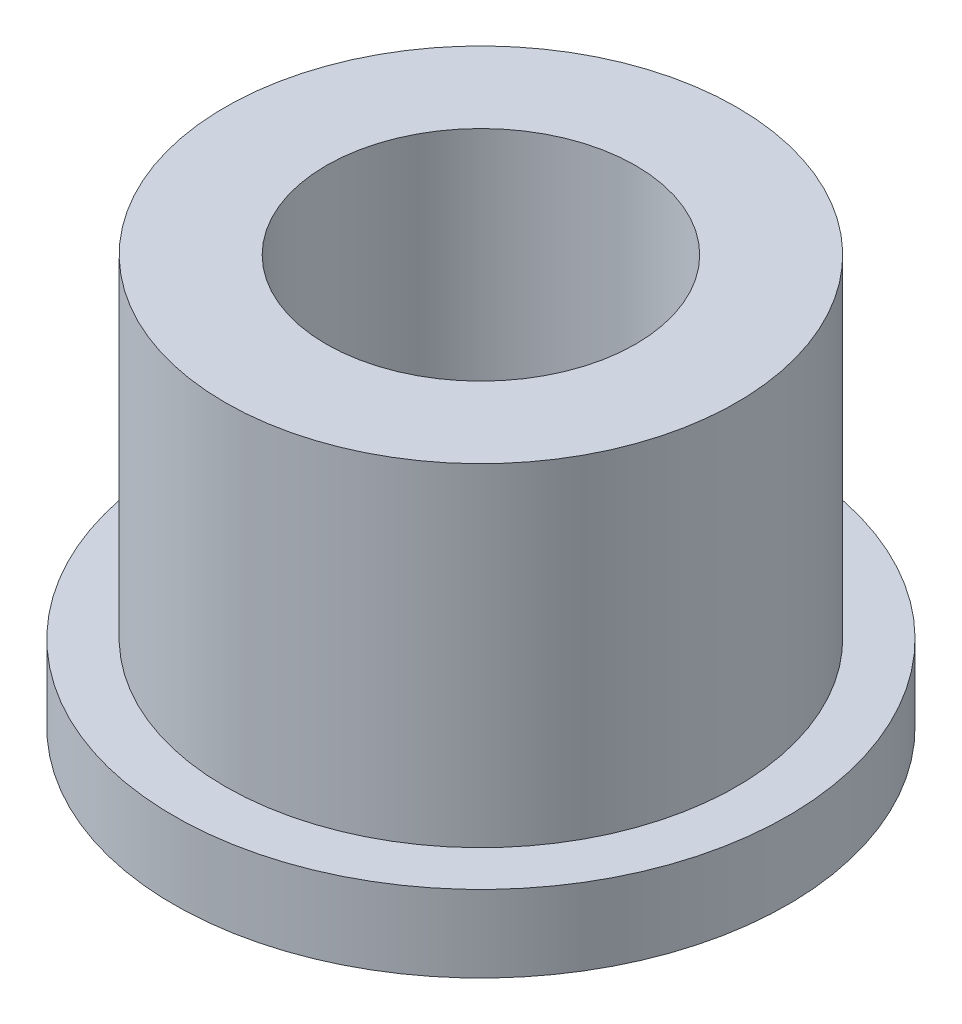
ISO-10303-21;
HEADER;
FILE_DESCRIPTION(('STEP AP214'),'2;1');
FILE_NAME('part.step','',(''),(''),'','','');
FILE_SCHEMA(('AUTOMOTIVE_DESIGN { 1 0 10303 214 1 1 1 1 }'));
ENDSEC;
DATA;
#1=APPLICATION_CONTEXT('core data for automotive mechanical design processes');
#2=APPLICATION_PROTOCOL_DEFINITION('international standard','automotive_design',2000,#1);
#3=PRODUCT_CONTEXT('',#1,'mechanical');
#4=PRODUCT('Part','Part','',(#3));
#5=PRODUCT_RELATED_PRODUCT_CATEGORY('part','',(#4));
#6=PRODUCT_DEFINITION_FORMATION('','',#4);
#7=PRODUCT_DEFINITION_CONTEXT('part definition',#1,'design');
#8=PRODUCT_DEFINITION('design','',#6,#7);
#9=PRODUCT_DEFINITION_SHAPE('','',#8);
#10=(LENGTH_UNIT() NAMED_UNIT(*) SI_UNIT(.MILLI.,.METRE.));
#11=(NAMED_UNIT(*) PLANE_ANGLE_UNIT() SI_UNIT($,.RADIAN.));
#12=(NAMED_UNIT(*) SI_UNIT($,.STERADIAN.) SOLID_ANGLE_UNIT());
#13=UNCERTAINTY_MEASURE_WITH_UNIT(LENGTH_MEASURE(1.E-05),#10,'distance_accuracy_value','');
#14=(GEOMETRIC_REPRESENTATION_CONTEXT(3) GLOBAL_UNCERTAINTY_ASSIGNED_CONTEXT((#13)) GLOBAL_UNIT_ASSIGNED_CONTEXT((#10,
#11,#12)) REPRESENTATION_CONTEXT('',''));
#15=CARTESIAN_POINT('',(0.,0.,0.));
#16=DIRECTION('',(0.,0.,1.));
#17=DIRECTION('',(1.,0.,0.));
#18=AXIS2_PLACEMENT_3D('',#15,#16,#17);
#19=CARTESIAN_POINT('',(0.,6.35,0.));
#20=DIRECTION('',(0.,1.,0.));
#21=DIRECTION('',(0.,0.,1.));
#22=AXIS2_PLACEMENT_3D('',#19,#20,#21);
#23=PLANE('',#22);
#24=CARTESIAN_POINT('',(0.,6.35,0.));
#25=DIRECTION('',(0.,1.,0.));
#26=DIRECTION('',(0.,0.,1.));
#27=AXIS2_PLACEMENT_3D('',#24,#25,#26);
#28=CIRCLE('',#27,3.96875);
#29=CARTESIAN_POINT('',(0.,6.35,3.96875));
#30=VERTEX_POINT('',#29);
#31=EDGE_CURVE('E10',#30,#30,#28,.T.);
#32=ORIENTED_EDGE('',*,*,#31,.T.);
#33=EDGE_LOOP('',(#32));
#34=FACE_BOUND('',#33,.T.);
#35=CARTESIAN_POINT('',(0.,6.35,0.));
#36=DIRECTION('',(0.,1.,0.));
#37=DIRECTION('',(0.,0.,1.));
#38=AXIS2_PLACEMENT_3D('',#35,#36,#37);
#39=CIRCLE('',#38,2.4003);
#40=CARTESIAN_POINT('',(0.,6.35,2.4003));
#41=VERTEX_POINT('',#40);
#42=EDGE_CURVE('E40',#41,#41,#39,.T.);
#43=ORIENTED_EDGE('',*,*,#42,.F.);
#44=EDGE_LOOP('',(#43));
#45=FACE_BOUND('',#44,.T.);
#46=ADVANCED_FACE('F33',(#34,#45),#23,.T.);
#47=CARTESIAN_POINT('',(0.,0.,0.));
#48=DIRECTION('',(0.,1.,0.));
#49=DIRECTION('',(0.,0.,1.));
#50=AXIS2_PLACEMENT_3D('',#47,#48,#49);
#51=PLANE('',#50);
#52=CARTESIAN_POINT('',(0.,0.,0.));
#53=DIRECTION('',(0.,1.,0.));
#54=DIRECTION('',(0.,0.,1.));
#55=AXIS2_PLACEMENT_3D('',#52,#53,#54);
#56=CIRCLE('',#55,2.4003);
#57=CARTESIAN_POINT('',(0.,0.,2.4003));
#58=VERTEX_POINT('',#57);
#59=EDGE_CURVE('E44',#58,#58,#56,.T.);
#60=ORIENTED_EDGE('',*,*,#59,.T.);
#61=EDGE_LOOP('',(#60));
#62=FACE_BOUND('',#61,.T.);
#63=CARTESIAN_POINT('',(0.,0.,0.));
#64=DIRECTION('',(0.,1.,0.));
#65=DIRECTION('',(0.,0.,1.));
#66=AXIS2_PLACEMENT_3D('',#63,#64,#65);
#67=CIRCLE('',#66,4.7625);
#68=CARTESIAN_POINT('',(0.,0.,-4.7625));
#69=VERTEX_POINT('',#68);
#70=EDGE_CURVE('E51',#69,#69,#67,.T.);
#71=ORIENTED_EDGE('',*,*,#70,.F.);
#72=EDGE_LOOP('',(#71));
#73=FACE_BOUND('',#72,.T.);
#74=ADVANCED_FACE('F76',(#62,#73),#51,.F.);
#75=CARTESIAN_POINT('',(0.,6.35,0.));
#76=DIRECTION('',(0.,-1.,0.));
#77=DIRECTION('',(0.,0.,-1.));
#78=AXIS2_PLACEMENT_3D('',#75,#76,#77);
#79=CYLINDRICAL_SURFACE('',#78,3.96875);
#80=CARTESIAN_POINT('',(0.,1.190625,0.));
#81=DIRECTION('',(0.,1.,0.));
#82=DIRECTION('',(0.,0.,1.));
#83=AXIS2_PLACEMENT_3D('',#80,#81,#82);
#84=CIRCLE('',#83,3.96875);
#85=CARTESIAN_POINT('',(0.,1.190625,3.96875));
#86=VERTEX_POINT('',#85);
#87=EDGE_CURVE('E54',#86,#86,#84,.T.);
#88=ORIENTED_EDGE('',*,*,#87,.T.);
#89=EDGE_LOOP('',(#88));
#90=FACE_BOUND('',#89,.T.);
#91=ORIENTED_EDGE('',*,*,#31,.F.);
#92=EDGE_LOOP('',(#91));
#93=FACE_BOUND('',#92,.T.);
#94=ADVANCED_FACE('F35',(#90,#93),#79,.T.);
#95=CARTESIAN_POINT('',(0.,6.35,0.));
#96=DIRECTION('',(0.,-1.,0.));
#97=DIRECTION('',(0.,0.,-1.));
#98=AXIS2_PLACEMENT_3D('',#95,#96,#97);
#99=CYLINDRICAL_SURFACE('',#98,2.4003);
#100=ORIENTED_EDGE('',*,*,#42,.T.);
#101=EDGE_LOOP('',(#100));
#102=FACE_BOUND('',#101,.T.);
#103=ORIENTED_EDGE('',*,*,#59,.F.);
#104=EDGE_LOOP('',(#103));
#105=FACE_BOUND('',#104,.T.);
#106=ADVANCED_FACE('F65',(#102,#105),#99,.F.);
#107=CARTESIAN_POINT('',(0.,1.190625,0.));
#108=DIRECTION('',(0.,1.,0.));
#109=DIRECTION('',(0.,0.,1.));
#110=AXIS2_PLACEMENT_3D('',#107,#108,#109);
#111=PLANE('',#110);
#112=CARTESIAN_POINT('',(0.,1.190625,0.));
#113=DIRECTION('',(0.,1.,0.));
#114=DIRECTION('',(0.,0.,1.));
#115=AXIS2_PLACEMENT_3D('',#112,#113,#114);
#116=CIRCLE('',#115,4.7625);
#117=CARTESIAN_POINT('',(0.,1.190625,-4.7625));
#118=VERTEX_POINT('',#117);
#119=EDGE_CURVE('E49',#118,#118,#116,.T.);
#120=ORIENTED_EDGE('',*,*,#119,.T.);
#121=EDGE_LOOP('',(#120));
#122=FACE_BOUND('',#121,.T.);
#123=ORIENTED_EDGE('',*,*,#87,.F.);
#124=EDGE_LOOP('',(#123));
#125=FACE_BOUND('',#124,.T.);
#126=ADVANCED_FACE('F62',(#122,#125),#111,.T.);
#127=CARTESIAN_POINT('',(0.,1.190625,0.));
#128=DIRECTION('',(0.,-1.,0.));
#129=DIRECTION('',(0.,0.,-1.));
#130=AXIS2_PLACEMENT_3D('',#127,#128,#129);
#131=CYLINDRICAL_SURFACE('',#130,4.7625);
#132=CARTESIAN_POINT('',(0.,1.190625,-4.7625));
#133=CARTESIAN_POINT('',(0.,1.17822265625,-4.7625));
#134=CARTESIAN_POINT('',(0.,1.1658203125,-4.7625));
#135=CARTESIAN_POINT('',(0.,1.141015625,-4.7625));
#136=CARTESIAN_POINT('',(0.,1.12861328125,-4.7625));
#137=CARTESIAN_POINT('',(0.,1.10380859375,-4.7625));
#138=CARTESIAN_POINT('',(0.,1.09140625,-4.7625));
#139=CARTESIAN_POINT('',(0.,1.0666015625,-4.7625));
#140=CARTESIAN_POINT('',(0.,1.05419921875,-4.7625));
#141=CARTESIAN_POINT('',(0.,1.02939453125,-4.7625));
#142=CARTESIAN_POINT('',(0.,1.0169921875,-4.7625));
#143=CARTESIAN_POINT('',(0.,0.9921875,-4.7625));
#144=CARTESIAN_POINT('',(0.,0.97978515625,-4.7625));
#145=CARTESIAN_POINT('',(0.,0.95498046875,-4.7625));
#146=CARTESIAN_POINT('',(0.,0.942578125,-4.7625));
#147=CARTESIAN_POINT('',(0.,0.9177734375,-4.7625));
#148=CARTESIAN_POINT('',(0.,0.90537109375,-4.7625));
#149=CARTESIAN_POINT('',(0.,0.88056640625,-4.7625));
#150=CARTESIAN_POINT('',(0.,0.8681640625,-4.7625));
#151=CARTESIAN_POINT('',(0.,0.843359375,-4.7625));
#152=CARTESIAN_POINT('',(0.,0.83095703125,-4.7625));
#153=CARTESIAN_POINT('',(0.,0.80615234375,-4.7625));
#154=CARTESIAN_POINT('',(0.,0.79375,-4.7625));
#155=CARTESIAN_POINT('',(0.,0.7689453125,-4.7625));
#156=CARTESIAN_POINT('',(0.,0.75654296875,-4.7625));
#157=CARTESIAN_POINT('',(0.,0.73173828125,-4.7625));
#158=CARTESIAN_POINT('',(0.,0.7193359375,-4.7625));
#159=CARTESIAN_POINT('',(0.,0.69453125,-4.7625));
#160=CARTESIAN_POINT('',(0.,0.68212890625,-4.7625));
#161=CARTESIAN_POINT('',(0.,0.65732421875,-4.7625));
#162=CARTESIAN_POINT('',(0.,0.644921875,-4.7625));
#163=CARTESIAN_POINT('',(0.,0.6201171875,-4.7625));
#164=CARTESIAN_POINT('',(0.,0.60771484375,-4.7625));
#165=CARTESIAN_POINT('',(0.,0.58291015625,-4.7625));
#166=CARTESIAN_POINT('',(0.,0.5705078125,-4.7625));
#167=CARTESIAN_POINT('',(0.,0.545703125,-4.7625));
#168=CARTESIAN_POINT('',(0.,0.53330078125,-4.7625));
#169=CARTESIAN_POINT('',(0.,0.50849609375,-4.7625));
#170=CARTESIAN_POINT('',(0.,0.49609375,-4.7625));
#171=CARTESIAN_POINT('',(0.,0.4712890625,-4.7625));
#172=CARTESIAN_POINT('',(0.,0.45888671875,-4.7625));
#173=CARTESIAN_POINT('',(0.,0.43408203125,-4.7625));
#174=CARTESIAN_POINT('',(0.,0.4216796875,-4.7625));
#175=CARTESIAN_POINT('',(0.,0.396875,-4.7625));
#176=CARTESIAN_POINT('',(0.,0.38447265625,-4.7625));
#177=CARTESIAN_POINT('',(0.,0.35966796875,-4.7625));
#178=CARTESIAN_POINT('',(0.,0.347265625,-4.7625));
#179=CARTESIAN_POINT('',(0.,0.3224609375,-4.7625));
#180=CARTESIAN_POINT('',(0.,0.31005859375,-4.7625));
#181=CARTESIAN_POINT('',(0.,0.28525390625,-4.7625));
#182=CARTESIAN_POINT('',(0.,0.2728515625,-4.7625));
#183=CARTESIAN_POINT('',(0.,0.248046875,-4.7625));
#184=CARTESIAN_POINT('',(0.,0.23564453125,-4.7625));
#185=CARTESIAN_POINT('',(0.,0.21083984375,-4.7625));
#186=CARTESIAN_POINT('',(0.,0.1984375,-4.7625));
#187=CARTESIAN_POINT('',(0.,0.1736328125,-4.7625));
#188=CARTESIAN_POINT('',(0.,0.16123046875,-4.7625));
#189=CARTESIAN_POINT('',(0.,0.13642578125,-4.7625));
#190=CARTESIAN_POINT('',(0.,0.1240234375,-4.7625));
#191=CARTESIAN_POINT('',(0.,0.0992187500000001,-4.7625));
#192=CARTESIAN_POINT('',(0.,0.08681640625,-4.7625));
#193=CARTESIAN_POINT('',(0.,0.06201171875,-4.7625));
#194=CARTESIAN_POINT('',(0.,0.049609375,-4.7625));
#195=CARTESIAN_POINT('',(0.,0.0248046875,-4.7625));
#196=CARTESIAN_POINT('',(0.,0.01240234375,-4.7625));
#197=CARTESIAN_POINT('',(0.,0.,-4.7625));
#198=B_SPLINE_CURVE_WITH_KNOTS('',3,(#132,#133,#134,#135,#136,#137,#138,#139,#140,#141,#142,
#143,#144,#145,#146,#147,#148,#149,#150,#151,#152,#153,#154,#155,#156,#157,#158,#159,#160,#161,
#162,#163,#164,#165,#166,#167,#168,#169,#170,#171,#172,#173,#174,#175,#176,#177,#178,#179,#180,
#181,#182,#183,#184,#185,#186,#187,#188,#189,#190,#191,#192,#193,#194,#195,#196,#197),
.UNSPECIFIED.,.F.,.F.,(4,2,2,2,2,2,2,2,2,2,2,2,2,2,2,2,2,2,2,2,2,2,2,2,2,2,2,2,2,2,2,2,4),(0.,
0.03720703125,0.0744140625,0.11162109375,0.148828125,0.18603515625,0.2232421875,0.26044921875,
0.29765625,0.33486328125,0.3720703125,0.40927734375,0.446484375,0.48369140625,0.5208984375,
0.55810546875,0.5953125,0.63251953125,0.6697265625,0.70693359375,0.744140625,0.78134765625,
0.8185546875,0.85576171875,0.89296875,0.93017578125,0.9673828125,1.00458984375,1.041796875,
1.07900390625,1.1162109375,1.15341796875,1.190625),.UNSPECIFIED.);
#199=EDGE_CURVE('BSEAM64',#118,#69,#198,.T.);
#200=ORIENTED_EDGE('',*,*,#119,.F.);
#201=ORIENTED_EDGE('',*,*,#70,.T.);
#202=ORIENTED_EDGE('',*,*,#199,.T.);
#203=ORIENTED_EDGE('',*,*,#199,.F.);
#204=EDGE_LOOP('',(#200,#202,#201,#203));
#205=FACE_BOUND('',#204,.T.);
#206=ADVANCED_FACE('F64',(#205),#131,.T.);
#207=CLOSED_SHELL('',(#46,#74,#94,#106,#126,#206));
#208=MANIFOLD_SOLID_BREP('B2',#207);
#209=ADVANCED_BREP_SHAPE_REPRESENTATION('',(#18,#208),#14);
#210=SHAPE_DEFINITION_REPRESENTATION(#9,#209);
ENDSEC;
END-ISO-10303-21;
